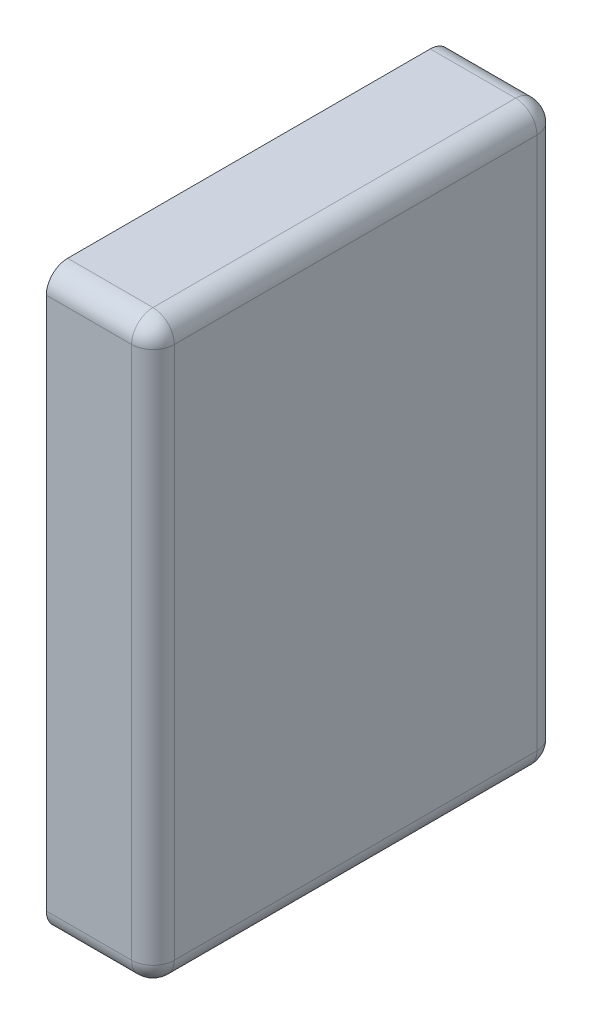
ISO-10303-21;
HEADER;
FILE_DESCRIPTION(('STEP AP214'),'2;1');
FILE_NAME('part.step','',(''),(''),'','','');
FILE_SCHEMA(('AUTOMOTIVE_DESIGN { 1 0 10303 214 1 1 1 1 }'));
ENDSEC;
DATA;
#1=APPLICATION_CONTEXT('core data for automotive mechanical design processes');
#2=APPLICATION_PROTOCOL_DEFINITION('international standard','automotive_design',2000,#1);
#3=PRODUCT_CONTEXT('',#1,'mechanical');
#4=PRODUCT('Part','Part','',(#3));
#5=PRODUCT_RELATED_PRODUCT_CATEGORY('part','',(#4));
#6=PRODUCT_DEFINITION_FORMATION('','',#4);
#7=PRODUCT_DEFINITION_CONTEXT('part definition',#1,'design');
#8=PRODUCT_DEFINITION('design','',#6,#7);
#9=PRODUCT_DEFINITION_SHAPE('','',#8);
#10=(LENGTH_UNIT() NAMED_UNIT(*) SI_UNIT(.MILLI.,.METRE.));
#11=(NAMED_UNIT(*) PLANE_ANGLE_UNIT() SI_UNIT($,.RADIAN.));
#12=(NAMED_UNIT(*) SI_UNIT($,.STERADIAN.) SOLID_ANGLE_UNIT());
#13=UNCERTAINTY_MEASURE_WITH_UNIT(LENGTH_MEASURE(1.E-05),#10,'distance_accuracy_value','');
#14=(GEOMETRIC_REPRESENTATION_CONTEXT(3) GLOBAL_UNCERTAINTY_ASSIGNED_CONTEXT((#13)) GLOBAL_UNIT_ASSIGNED_CONTEXT((#10,
#11,#12)) REPRESENTATION_CONTEXT('',''));
#15=CARTESIAN_POINT('',(0.,0.,0.));
#16=DIRECTION('',(0.,0.,1.));
#17=DIRECTION('',(1.,0.,0.));
#18=AXIS2_PLACEMENT_3D('',#15,#16,#17);
#19=CARTESIAN_POINT('',(2.05,1.3,0.9));
#20=DIRECTION('',(0.,-1.,0.));
#21=DIRECTION('',(1.,0.,0.));
#22=AXIS2_PLACEMENT_3D('',#19,#20,#21);
#23=SPHERICAL_SURFACE('',#22,0.05);
#24=CARTESIAN_POINT('',(2.05,1.3,0.9));
#25=DIRECTION('',(0.,0.,-1.));
#26=DIRECTION('',(1.,0.,0.));
#27=AXIS2_PLACEMENT_3D('',#24,#25,#26);
#28=CIRCLE('',#27,0.05);
#29=CARTESIAN_POINT('',(2.05,1.35,0.9));
#30=VERTEX_POINT('',#29);
#31=CARTESIAN_POINT('',(2.1,1.3,0.9));
#32=VERTEX_POINT('',#31);
#33=EDGE_CURVE('E11',#30,#32,#28,.T.);
#34=ORIENTED_EDGE('',*,*,#33,.F.);
#35=CARTESIAN_POINT('',(2.05,1.3,0.9));
#36=DIRECTION('',(1.,0.,0.));
#37=DIRECTION('',(0.,0.,1.));
#38=AXIS2_PLACEMENT_3D('',#35,#36,#37);
#39=CIRCLE('',#38,0.05);
#40=CARTESIAN_POINT('',(2.05,1.3,0.95));
#41=VERTEX_POINT('',#40);
#42=EDGE_CURVE('E217',#30,#41,#39,.T.);
#43=ORIENTED_EDGE('',*,*,#42,.T.);
#44=CARTESIAN_POINT('',(2.05,1.3,0.9));
#45=DIRECTION('',(0.,-1.,0.));
#46=DIRECTION('',(1.,0.,0.));
#47=AXIS2_PLACEMENT_3D('',#44,#45,#46);
#48=CIRCLE('',#47,0.05);
#49=EDGE_CURVE('E225',#32,#41,#48,.T.);
#50=ORIENTED_EDGE('',*,*,#49,.F.);
#51=EDGE_LOOP('',(#34,#43,#50));
#52=FACE_BOUND('',#51,.T.);
#53=ADVANCED_FACE('F17',(#52),#23,.T.);
#54=CARTESIAN_POINT('',(2.05,1.3,0.05));
#55=DIRECTION('',(0.,0.,1.));
#56=DIRECTION('',(1.,0.,0.));
#57=AXIS2_PLACEMENT_3D('',#54,#55,#56);
#58=SPHERICAL_SURFACE('',#57,0.05);
#59=CARTESIAN_POINT('',(2.05,1.3,0.05));
#60=DIRECTION('',(0.,-1.,0.));
#61=DIRECTION('',(1.,0.,0.));
#62=AXIS2_PLACEMENT_3D('',#59,#60,#61);
#63=CIRCLE('',#62,0.05);
#64=CARTESIAN_POINT('',(2.05,1.3,0.));
#65=VERTEX_POINT('',#64);
#66=CARTESIAN_POINT('',(2.1,1.3,0.05));
#67=VERTEX_POINT('',#66);
#68=EDGE_CURVE('E221',#65,#67,#63,.T.);
#69=ORIENTED_EDGE('',*,*,#68,.F.);
#70=CARTESIAN_POINT('',(2.05,1.3,0.05));
#71=DIRECTION('',(1.,0.,0.));
#72=DIRECTION('',(0.,1.,0.));
#73=AXIS2_PLACEMENT_3D('',#70,#71,#72);
#74=CIRCLE('',#73,0.05);
#75=CARTESIAN_POINT('',(2.05,1.35,0.05));
#76=VERTEX_POINT('',#75);
#77=EDGE_CURVE('E209',#65,#76,#74,.T.);
#78=ORIENTED_EDGE('',*,*,#77,.T.);
#79=CARTESIAN_POINT('',(2.05,1.3,0.05));
#80=DIRECTION('',(0.,0.,1.));
#81=DIRECTION('',(1.,0.,0.));
#82=AXIS2_PLACEMENT_3D('',#79,#80,#81);
#83=CIRCLE('',#82,0.05);
#84=EDGE_CURVE('E25',#67,#76,#83,.T.);
#85=ORIENTED_EDGE('',*,*,#84,.F.);
#86=EDGE_LOOP('',(#69,#78,#85));
#87=FACE_BOUND('',#86,.T.);
#88=ADVANCED_FACE('F344',(#87),#58,.T.);
#89=CARTESIAN_POINT('',(2.05,1.3,0.));
#90=DIRECTION('',(0.,0.,1.));
#91=DIRECTION('',(1.,0.,0.));
#92=AXIS2_PLACEMENT_3D('',#89,#90,#91);
#93=CYLINDRICAL_SURFACE('',#92,0.05);
#94=DIRECTION('',(0.,0.,1.));
#95=VECTOR('',#94,1.);
#96=CARTESIAN_POINT('',(2.1,1.3,0.));
#97=LINE('',#96,#95);
#98=EDGE_CURVE('E137',#67,#32,#97,.T.);
#99=ORIENTED_EDGE('',*,*,#98,.F.);
#100=ORIENTED_EDGE('',*,*,#84,.T.);
#101=DIRECTION('',(0.,0.,1.));
#102=VECTOR('',#101,1.);
#103=CARTESIAN_POINT('',(2.05,1.35,0.));
#104=LINE('',#103,#102);
#105=EDGE_CURVE('E220',#76,#30,#104,.T.);
#106=ORIENTED_EDGE('',*,*,#105,.T.);
#107=ORIENTED_EDGE('',*,*,#33,.T.);
#108=EDGE_LOOP('',(#99,#100,#106,#107));
#109=FACE_BOUND('',#108,.T.);
#110=ADVANCED_FACE('F349',(#109),#93,.T.);
#111=CARTESIAN_POINT('',(2.05,0.,0.9));
#112=DIRECTION('',(0.,1.,0.));
#113=DIRECTION('',(1.,0.,0.));
#114=AXIS2_PLACEMENT_3D('',#111,#112,#113);
#115=CYLINDRICAL_SURFACE('',#114,0.05);
#116=DIRECTION('',(0.,1.,0.));
#117=VECTOR('',#116,1.);
#118=CARTESIAN_POINT('',(2.1,0.,0.9));
#119=LINE('',#118,#117);
#120=CARTESIAN_POINT('',(2.1,0.05,0.9));
#121=VERTEX_POINT('',#120);
#122=EDGE_CURVE('E121',#121,#32,#119,.T.);
#123=ORIENTED_EDGE('',*,*,#122,.T.);
#124=ORIENTED_EDGE('',*,*,#49,.T.);
#125=DIRECTION('',(0.,1.,0.));
#126=VECTOR('',#125,1.);
#127=CARTESIAN_POINT('',(2.05,0.,0.95));
#128=LINE('',#127,#126);
#129=CARTESIAN_POINT('',(2.05,0.05,0.95));
#130=VERTEX_POINT('',#129);
#131=EDGE_CURVE('E124',#130,#41,#128,.T.);
#132=ORIENTED_EDGE('',*,*,#131,.F.);
#133=CARTESIAN_POINT('',(2.05,0.05,0.9));
#134=DIRECTION('',(0.,1.,0.));
#135=DIRECTION('',(1.,0.,0.));
#136=AXIS2_PLACEMENT_3D('',#133,#134,#135);
#137=CIRCLE('',#136,0.05);
#138=EDGE_CURVE('E118',#130,#121,#137,.T.);
#139=ORIENTED_EDGE('',*,*,#138,.T.);
#140=EDGE_LOOP('',(#123,#124,#132,#139));
#141=FACE_BOUND('',#140,.T.);
#142=ADVANCED_FACE('F120',(#141),#115,.T.);
#143=CARTESIAN_POINT('',(2.05,0.,0.05));
#144=DIRECTION('',(0.,1.,0.));
#145=DIRECTION('',(1.,0.,0.));
#146=AXIS2_PLACEMENT_3D('',#143,#144,#145);
#147=CYLINDRICAL_SURFACE('',#146,0.05);
#148=CARTESIAN_POINT('',(2.05,0.05,0.05));
#149=DIRECTION('',(0.,-1.,0.));
#150=DIRECTION('',(1.,0.,0.));
#151=AXIS2_PLACEMENT_3D('',#148,#149,#150);
#152=CIRCLE('',#151,0.05);
#153=CARTESIAN_POINT('',(2.05,0.05,0.));
#154=VERTEX_POINT('',#153);
#155=CARTESIAN_POINT('',(2.1,0.05,0.05));
#156=VERTEX_POINT('',#155);
#157=EDGE_CURVE('E188',#154,#156,#152,.T.);
#158=ORIENTED_EDGE('',*,*,#157,.F.);
#159=DIRECTION('',(0.,1.,0.));
#160=VECTOR('',#159,1.);
#161=CARTESIAN_POINT('',(2.05,0.,0.));
#162=LINE('',#161,#160);
#163=EDGE_CURVE('E196',#154,#65,#162,.T.);
#164=ORIENTED_EDGE('',*,*,#163,.T.);
#165=ORIENTED_EDGE('',*,*,#68,.T.);
#166=DIRECTION('',(0.,1.,0.));
#167=VECTOR('',#166,1.);
#168=CARTESIAN_POINT('',(2.1,0.,0.05));
#169=LINE('',#168,#167);
#170=EDGE_CURVE('E178',#156,#67,#169,.T.);
#171=ORIENTED_EDGE('',*,*,#170,.F.);
#172=EDGE_LOOP('',(#158,#164,#165,#171));
#173=FACE_BOUND('',#172,.T.);
#174=ADVANCED_FACE('F242',(#173),#147,.T.);
#175=CARTESIAN_POINT('',(0.,1.35,0.));
#176=DIRECTION('',(0.,1.,0.));
#177=DIRECTION('',(1.,0.,0.));
#178=AXIS2_PLACEMENT_3D('',#175,#176,#177);
#179=PLANE('',#178);
#180=DIRECTION('',(1.,0.,0.));
#181=VECTOR('',#180,1.);
#182=CARTESIAN_POINT('',(0.,1.35,0.05));
#183=LINE('',#182,#181);
#184=CARTESIAN_POINT('',(1.85,1.35,0.05));
#185=VERTEX_POINT('',#184);
#186=EDGE_CURVE('E205',#185,#76,#183,.T.);
#187=ORIENTED_EDGE('',*,*,#186,.F.);
#188=DIRECTION('',(0.,0.,1.));
#189=VECTOR('',#188,1.);
#190=CARTESIAN_POINT('',(1.85,1.35,0.));
#191=LINE('',#190,#189);
#192=CARTESIAN_POINT('',(1.85,1.35,0.9));
#193=VERTEX_POINT('',#192);
#194=EDGE_CURVE('E184',#185,#193,#191,.T.);
#195=ORIENTED_EDGE('',*,*,#194,.T.);
#196=DIRECTION('',(1.,0.,0.));
#197=VECTOR('',#196,1.);
#198=CARTESIAN_POINT('',(0.,1.35,0.9));
#199=LINE('',#198,#197);
#200=EDGE_CURVE('E213',#193,#30,#199,.T.);
#201=ORIENTED_EDGE('',*,*,#200,.T.);
#202=ORIENTED_EDGE('',*,*,#105,.F.);
#203=EDGE_LOOP('',(#187,#195,#201,#202));
#204=FACE_BOUND('',#203,.T.);
#205=ADVANCED_FACE('F236',(#204),#179,.T.);
#206=CARTESIAN_POINT('',(0.,1.3,0.9));
#207=DIRECTION('',(1.,0.,0.));
#208=DIRECTION('',(0.,1.,0.));
#209=AXIS2_PLACEMENT_3D('',#206,#207,#208);
#210=CYLINDRICAL_SURFACE('',#209,0.05);
#211=ORIENTED_EDGE('',*,*,#200,.F.);
#212=CARTESIAN_POINT('',(1.85,1.3,0.9));
#213=DIRECTION('',(1.,0.,0.));
#214=DIRECTION('',(0.,1.,0.));
#215=AXIS2_PLACEMENT_3D('',#212,#213,#214);
#216=CIRCLE('',#215,0.05);
#217=CARTESIAN_POINT('',(1.85,1.3,0.95));
#218=VERTEX_POINT('',#217);
#219=EDGE_CURVE('E424',#193,#218,#216,.T.);
#220=ORIENTED_EDGE('',*,*,#219,.T.);
#221=DIRECTION('',(1.,0.,0.));
#222=VECTOR('',#221,1.);
#223=CARTESIAN_POINT('',(0.,1.3,0.95));
#224=LINE('',#223,#222);
#225=EDGE_CURVE('E169',#218,#41,#224,.T.);
#226=ORIENTED_EDGE('',*,*,#225,.T.);
#227=ORIENTED_EDGE('',*,*,#42,.F.);
#228=EDGE_LOOP('',(#211,#220,#226,#227));
#229=FACE_BOUND('',#228,.T.);
#230=ADVANCED_FACE('F241',(#229),#210,.T.);
#231=CARTESIAN_POINT('',(0.,1.3,0.05));
#232=DIRECTION('',(1.,0.,0.));
#233=DIRECTION('',(0.,1.,0.));
#234=AXIS2_PLACEMENT_3D('',#231,#232,#233);
#235=CYLINDRICAL_SURFACE('',#234,0.05);
#236=ORIENTED_EDGE('',*,*,#186,.T.);
#237=ORIENTED_EDGE('',*,*,#77,.F.);
#238=DIRECTION('',(1.,0.,0.));
#239=VECTOR('',#238,1.);
#240=CARTESIAN_POINT('',(0.,1.3,0.));
#241=LINE('',#240,#239);
#242=CARTESIAN_POINT('',(1.85,1.3,0.));
#243=VERTEX_POINT('',#242);
#244=EDGE_CURVE('E192',#243,#65,#241,.T.);
#245=ORIENTED_EDGE('',*,*,#244,.F.);
#246=CARTESIAN_POINT('',(1.85,1.3,0.05));
#247=DIRECTION('',(1.,0.,0.));
#248=DIRECTION('',(0.,1.,0.));
#249=AXIS2_PLACEMENT_3D('',#246,#247,#248);
#250=CIRCLE('',#249,0.05);
#251=EDGE_CURVE('E179',#243,#185,#250,.T.);
#252=ORIENTED_EDGE('',*,*,#251,.T.);
#253=EDGE_LOOP('',(#236,#237,#245,#252));
#254=FACE_BOUND('',#253,.T.);
#255=ADVANCED_FACE('F330',(#254),#235,.T.);
#256=CARTESIAN_POINT('',(0.,0.,0.95));
#257=DIRECTION('',(0.,0.,1.));
#258=DIRECTION('',(1.,0.,0.));
#259=AXIS2_PLACEMENT_3D('',#256,#257,#258);
#260=PLANE('',#259);
#261=DIRECTION('',(0.,1.,0.));
#262=VECTOR('',#261,1.);
#263=CARTESIAN_POINT('',(1.85,0.,0.95));
#264=LINE('',#263,#262);
#265=CARTESIAN_POINT('',(1.85,0.05,0.95));
#266=VERTEX_POINT('',#265);
#267=EDGE_CURVE('E175',#266,#218,#264,.T.);
#268=ORIENTED_EDGE('',*,*,#267,.F.);
#269=DIRECTION('',(1.,0.,0.));
#270=VECTOR('',#269,1.);
#271=CARTESIAN_POINT('',(0.,0.05,0.95));
#272=LINE('',#271,#270);
#273=EDGE_CURVE('E166',#266,#130,#272,.T.);
#274=ORIENTED_EDGE('',*,*,#273,.T.);
#275=ORIENTED_EDGE('',*,*,#131,.T.);
#276=ORIENTED_EDGE('',*,*,#225,.F.);
#277=EDGE_LOOP('',(#268,#274,#275,#276));
#278=FACE_BOUND('',#277,.T.);
#279=ADVANCED_FACE('F339',(#278),#260,.T.);
#280=CARTESIAN_POINT('',(2.05,0.05,0.9));
#281=DIRECTION('',(0.,0.,-1.));
#282=DIRECTION('',(1.,0.,0.));
#283=AXIS2_PLACEMENT_3D('',#280,#281,#282);
#284=SPHERICAL_SURFACE('',#283,0.05);
#285=ORIENTED_EDGE('',*,*,#138,.F.);
#286=CARTESIAN_POINT('',(2.05,0.05,0.9));
#287=DIRECTION('',(1.,0.,0.));
#288=DIRECTION('',(0.,-1.,0.));
#289=AXIS2_PLACEMENT_3D('',#286,#287,#288);
#290=CIRCLE('',#289,0.05);
#291=CARTESIAN_POINT('',(2.05,0.,0.9));
#292=VERTEX_POINT('',#291);
#293=EDGE_CURVE('E148',#130,#292,#290,.T.);
#294=ORIENTED_EDGE('',*,*,#293,.T.);
#295=CARTESIAN_POINT('',(2.05,0.05,0.9));
#296=DIRECTION('',(0.,0.,-1.));
#297=DIRECTION('',(1.,0.,0.));
#298=AXIS2_PLACEMENT_3D('',#295,#296,#297);
#299=CIRCLE('',#298,0.05);
#300=EDGE_CURVE('E144',#121,#292,#299,.T.);
#301=ORIENTED_EDGE('',*,*,#300,.F.);
#302=EDGE_LOOP('',(#285,#294,#301));
#303=FACE_BOUND('',#302,.T.);
#304=ADVANCED_FACE('F150',(#303),#284,.T.);
#305=CARTESIAN_POINT('',(2.1,0.,0.));
#306=DIRECTION('',(1.,0.,0.));
#307=DIRECTION('',(0.,1.,0.));
#308=AXIS2_PLACEMENT_3D('',#305,#306,#307);
#309=PLANE('',#308);
#310=DIRECTION('',(0.,0.,1.));
#311=VECTOR('',#310,1.);
#312=CARTESIAN_POINT('',(2.1,0.05,0.));
#313=LINE('',#312,#311);
#314=EDGE_CURVE('E135',#156,#121,#313,.T.);
#315=ORIENTED_EDGE('',*,*,#314,.F.);
#316=ORIENTED_EDGE('',*,*,#170,.T.);
#317=ORIENTED_EDGE('',*,*,#98,.T.);
#318=ORIENTED_EDGE('',*,*,#122,.F.);
#319=EDGE_LOOP('',(#315,#316,#317,#318));
#320=FACE_BOUND('',#319,.T.);
#321=ADVANCED_FACE('F133',(#320),#309,.T.);
#322=CARTESIAN_POINT('',(0.,0.,0.));
#323=DIRECTION('',(0.,0.,1.));
#324=DIRECTION('',(1.,0.,0.));
#325=AXIS2_PLACEMENT_3D('',#322,#323,#324);
#326=PLANE('',#325);
#327=ORIENTED_EDGE('',*,*,#244,.T.);
#328=ORIENTED_EDGE('',*,*,#163,.F.);
#329=DIRECTION('',(1.,0.,0.));
#330=VECTOR('',#329,1.);
#331=CARTESIAN_POINT('',(0.,0.05,0.));
#332=LINE('',#331,#330);
#333=CARTESIAN_POINT('',(1.85,0.05,0.));
#334=VERTEX_POINT('',#333);
#335=EDGE_CURVE('E160',#334,#154,#332,.T.);
#336=ORIENTED_EDGE('',*,*,#335,.F.);
#337=DIRECTION('',(0.,1.,0.));
#338=VECTOR('',#337,1.);
#339=CARTESIAN_POINT('',(1.85,0.,0.));
#340=LINE('',#339,#338);
#341=EDGE_CURVE('E183',#334,#243,#340,.T.);
#342=ORIENTED_EDGE('',*,*,#341,.T.);
#343=EDGE_LOOP('',(#327,#328,#336,#342));
#344=FACE_BOUND('',#343,.T.);
#345=ADVANCED_FACE('F298',(#344),#326,.F.);
#346=CARTESIAN_POINT('',(2.05,0.05,0.05));
#347=DIRECTION('',(0.,0.,1.));
#348=DIRECTION('',(1.,0.,0.));
#349=AXIS2_PLACEMENT_3D('',#346,#347,#348);
#350=SPHERICAL_SURFACE('',#349,0.05);
#351=CARTESIAN_POINT('',(2.05,0.05,0.05));
#352=DIRECTION('',(0.,0.,-1.));
#353=DIRECTION('',(1.,0.,0.));
#354=AXIS2_PLACEMENT_3D('',#351,#352,#353);
#355=CIRCLE('',#354,0.05);
#356=CARTESIAN_POINT('',(2.05,0.,0.05));
#357=VERTEX_POINT('',#356);
#358=EDGE_CURVE('E146',#156,#357,#355,.T.);
#359=ORIENTED_EDGE('',*,*,#358,.T.);
#360=CARTESIAN_POINT('',(2.05,0.05,0.05));
#361=DIRECTION('',(-1.,0.,0.));
#362=DIRECTION('',(0.,-1.,0.));
#363=AXIS2_PLACEMENT_3D('',#360,#361,#362);
#364=CIRCLE('',#363,0.05);
#365=EDGE_CURVE('E153',#154,#357,#364,.T.);
#366=ORIENTED_EDGE('',*,*,#365,.F.);
#367=ORIENTED_EDGE('',*,*,#157,.T.);
#368=EDGE_LOOP('',(#359,#366,#367));
#369=FACE_BOUND('',#368,.T.);
#370=ADVANCED_FACE('F289',(#369),#350,.T.);
#371=CARTESIAN_POINT('',(1.85,0.,0.));
#372=DIRECTION('',(1.,0.,0.));
#373=DIRECTION('',(0.,1.,0.));
#374=AXIS2_PLACEMENT_3D('',#371,#372,#373);
#375=PLANE('',#374);
#376=CARTESIAN_POINT('',(1.85,0.05,0.9));
#377=DIRECTION('',(1.,0.,0.));
#378=DIRECTION('',(0.,-1.,0.));
#379=AXIS2_PLACEMENT_3D('',#376,#377,#378);
#380=CIRCLE('',#379,0.05);
#381=CARTESIAN_POINT('',(1.85,0.,0.9));
#382=VERTEX_POINT('',#381);
#383=EDGE_CURVE('E172',#266,#382,#380,.T.);
#384=ORIENTED_EDGE('',*,*,#383,.F.);
#385=ORIENTED_EDGE('',*,*,#267,.T.);
#386=ORIENTED_EDGE('',*,*,#219,.F.);
#387=ORIENTED_EDGE('',*,*,#194,.F.);
#388=ORIENTED_EDGE('',*,*,#251,.F.);
#389=ORIENTED_EDGE('',*,*,#341,.F.);
#390=CARTESIAN_POINT('',(1.85,0.05,0.05));
#391=DIRECTION('',(1.,0.,0.));
#392=DIRECTION('',(0.,-1.,0.));
#393=AXIS2_PLACEMENT_3D('',#390,#391,#392);
#394=CIRCLE('',#393,0.05);
#395=CARTESIAN_POINT('',(1.85,0.,0.05));
#396=VERTEX_POINT('',#395);
#397=EDGE_CURVE('E414',#396,#334,#394,.T.);
#398=ORIENTED_EDGE('',*,*,#397,.F.);
#399=DIRECTION('',(0.,0.,1.));
#400=VECTOR('',#399,1.);
#401=CARTESIAN_POINT('',(1.85,0.,0.));
#402=LINE('',#401,#400);
#403=EDGE_CURVE('E437',#396,#382,#402,.T.);
#404=ORIENTED_EDGE('',*,*,#403,.T.);
#405=EDGE_LOOP('',(#384,#385,#386,#387,#388,#389,#398,#404));
#406=FACE_BOUND('',#405,.T.);
#407=ADVANCED_FACE('F280',(#406),#375,.F.);
#408=CARTESIAN_POINT('',(0.,0.05,0.9));
#409=DIRECTION('',(1.,0.,0.));
#410=DIRECTION('',(0.,-1.,0.));
#411=AXIS2_PLACEMENT_3D('',#408,#409,#410);
#412=CYLINDRICAL_SURFACE('',#411,0.05);
#413=DIRECTION('',(1.,0.,0.));
#414=VECTOR('',#413,1.);
#415=CARTESIAN_POINT('',(0.,0.,0.9));
#416=LINE('',#415,#414);
#417=EDGE_CURVE('E441',#382,#292,#416,.T.);
#418=ORIENTED_EDGE('',*,*,#417,.T.);
#419=ORIENTED_EDGE('',*,*,#293,.F.);
#420=ORIENTED_EDGE('',*,*,#273,.F.);
#421=ORIENTED_EDGE('',*,*,#383,.T.);
#422=EDGE_LOOP('',(#418,#419,#420,#421));
#423=FACE_BOUND('',#422,.T.);
#424=ADVANCED_FACE('F272',(#423),#412,.T.);
#425=CARTESIAN_POINT('',(2.05,0.05,0.));
#426=DIRECTION('',(0.,0.,1.));
#427=DIRECTION('',(1.,0.,0.));
#428=AXIS2_PLACEMENT_3D('',#425,#426,#427);
#429=CYLINDRICAL_SURFACE('',#428,0.05);
#430=ORIENTED_EDGE('',*,*,#300,.T.);
#431=DIRECTION('',(0.,0.,1.));
#432=VECTOR('',#431,1.);
#433=CARTESIAN_POINT('',(2.05,0.,0.));
#434=LINE('',#433,#432);
#435=EDGE_CURVE('E444',#357,#292,#434,.T.);
#436=ORIENTED_EDGE('',*,*,#435,.F.);
#437=ORIENTED_EDGE('',*,*,#358,.F.);
#438=ORIENTED_EDGE('',*,*,#314,.T.);
#439=EDGE_LOOP('',(#430,#436,#437,#438));
#440=FACE_BOUND('',#439,.T.);
#441=ADVANCED_FACE('F142',(#440),#429,.T.);
#442=CARTESIAN_POINT('',(0.,0.05,0.05));
#443=DIRECTION('',(1.,0.,0.));
#444=DIRECTION('',(0.,-1.,0.));
#445=AXIS2_PLACEMENT_3D('',#442,#443,#444);
#446=CYLINDRICAL_SURFACE('',#445,0.05);
#447=ORIENTED_EDGE('',*,*,#397,.T.);
#448=ORIENTED_EDGE('',*,*,#335,.T.);
#449=ORIENTED_EDGE('',*,*,#365,.T.);
#450=DIRECTION('',(1.,0.,0.));
#451=VECTOR('',#450,1.);
#452=CARTESIAN_POINT('',(0.,0.,0.05));
#453=LINE('',#452,#451);
#454=EDGE_CURVE('E421',#396,#357,#453,.T.);
#455=ORIENTED_EDGE('',*,*,#454,.F.);
#456=EDGE_LOOP('',(#447,#448,#449,#455));
#457=FACE_BOUND('',#456,.T.);
#458=ADVANCED_FACE('F255',(#457),#446,.T.);
#459=CARTESIAN_POINT('',(0.,0.,0.));
#460=DIRECTION('',(0.,1.,0.));
#461=DIRECTION('',(1.,0.,0.));
#462=AXIS2_PLACEMENT_3D('',#459,#460,#461);
#463=PLANE('',#462);
#464=ORIENTED_EDGE('',*,*,#435,.T.);
#465=ORIENTED_EDGE('',*,*,#417,.F.);
#466=ORIENTED_EDGE('',*,*,#403,.F.);
#467=ORIENTED_EDGE('',*,*,#454,.T.);
#468=EDGE_LOOP('',(#464,#465,#466,#467));
#469=FACE_BOUND('',#468,.T.);
#470=ADVANCED_FACE('F250',(#469),#463,.F.);
#471=CLOSED_SHELL('',(#53,#88,#110,#142,#174,#205,#230,#255,#279,#304,#321,#345,#370,#407,#424,
#441,#458,#470));
#472=MANIFOLD_SOLID_BREP('B1',#471);
#473=ADVANCED_BREP_SHAPE_REPRESENTATION('',(#18,#472),#14);
#474=SHAPE_DEFINITION_REPRESENTATION(#9,#473);
ENDSEC;
END-ISO-10303-21;
